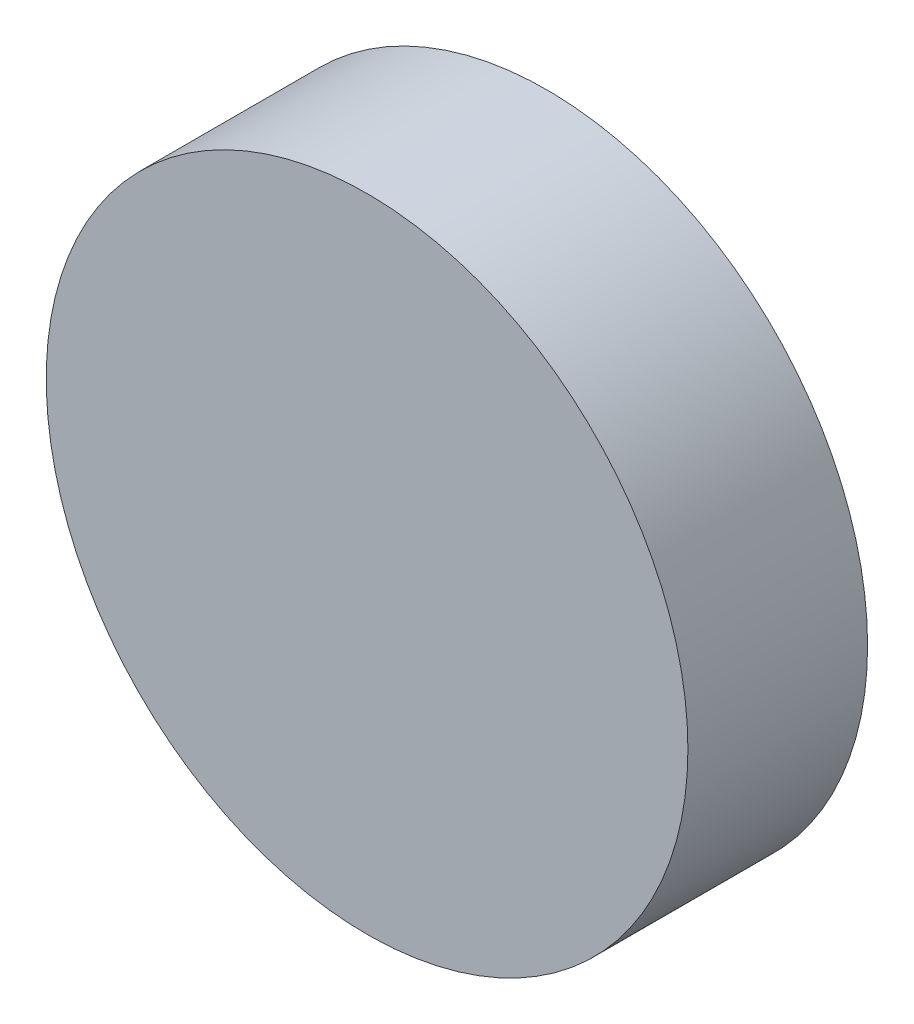
ISO-10303-21;
HEADER;
FILE_DESCRIPTION(('STEP AP214'),'2;1');
FILE_NAME('part.step','',(''),(''),'','','');
FILE_SCHEMA(('AUTOMOTIVE_DESIGN { 1 0 10303 214 1 1 1 1 }'));
ENDSEC;
DATA;
#1=APPLICATION_CONTEXT('core data for automotive mechanical design processes');
#2=APPLICATION_PROTOCOL_DEFINITION('international standard','automotive_design',2000,#1);
#3=PRODUCT_CONTEXT('',#1,'mechanical');
#4=PRODUCT('Part','Part','',(#3));
#5=PRODUCT_RELATED_PRODUCT_CATEGORY('part','',(#4));
#6=PRODUCT_DEFINITION_FORMATION('','',#4);
#7=PRODUCT_DEFINITION_CONTEXT('part definition',#1,'design');
#8=PRODUCT_DEFINITION('design','',#6,#7);
#9=PRODUCT_DEFINITION_SHAPE('','',#8);
#10=(LENGTH_UNIT() NAMED_UNIT(*) SI_UNIT(.MILLI.,.METRE.));
#11=(NAMED_UNIT(*) PLANE_ANGLE_UNIT() SI_UNIT($,.RADIAN.));
#12=(NAMED_UNIT(*) SI_UNIT($,.STERADIAN.) SOLID_ANGLE_UNIT());
#13=UNCERTAINTY_MEASURE_WITH_UNIT(LENGTH_MEASURE(1.E-05),#10,'distance_accuracy_value','');
#14=(GEOMETRIC_REPRESENTATION_CONTEXT(3) GLOBAL_UNCERTAINTY_ASSIGNED_CONTEXT((#13)) GLOBAL_UNIT_ASSIGNED_CONTEXT((#10,
#11,#12)) REPRESENTATION_CONTEXT('',''));
#15=CARTESIAN_POINT('',(0.,0.,0.));
#16=DIRECTION('',(0.,0.,1.));
#17=DIRECTION('',(1.,0.,0.));
#18=AXIS2_PLACEMENT_3D('',#15,#16,#17);
#19=CARTESIAN_POINT('',(0.,0.,70.));
#20=DIRECTION('',(0.,0.,-1.));
#21=DIRECTION('',(-1.,0.,0.));
#22=AXIS2_PLACEMENT_3D('',#19,#20,#21);
#23=CYLINDRICAL_SURFACE('',#22,125.);
#24=CARTESIAN_POINT('',(0.,0.,70.));
#25=DIRECTION('',(0.,0.,1.));
#26=DIRECTION('',(1.,0.,0.));
#27=AXIS2_PLACEMENT_3D('',#24,#25,#26);
#28=CIRCLE('',#27,125.);
#29=CARTESIAN_POINT('',(125.,0.,70.));
#30=VERTEX_POINT('',#29);
#31=EDGE_CURVE('E10',#30,#30,#28,.T.);
#32=ORIENTED_EDGE('',*,*,#31,.F.);
#33=EDGE_LOOP('',(#32));
#34=FACE_BOUND('',#33,.T.);
#35=CARTESIAN_POINT('',(0.,0.,0.));
#36=DIRECTION('',(0.,0.,1.));
#37=DIRECTION('',(1.,0.,0.));
#38=AXIS2_PLACEMENT_3D('',#35,#36,#37);
#39=CIRCLE('',#38,125.);
#40=CARTESIAN_POINT('',(125.,0.,0.));
#41=VERTEX_POINT('',#40);
#42=EDGE_CURVE('E32',#41,#41,#39,.T.);
#43=ORIENTED_EDGE('',*,*,#42,.T.);
#44=EDGE_LOOP('',(#43));
#45=FACE_BOUND('',#44,.T.);
#46=ADVANCED_FACE('F29',(#34,#45),#23,.T.);
#47=CARTESIAN_POINT('',(0.,0.,70.));
#48=DIRECTION('',(0.,0.,1.));
#49=DIRECTION('',(1.,0.,0.));
#50=AXIS2_PLACEMENT_3D('',#47,#48,#49);
#51=PLANE('',#50);
#52=ORIENTED_EDGE('',*,*,#31,.T.);
#53=EDGE_LOOP('',(#52));
#54=FACE_BOUND('',#53,.T.);
#55=ADVANCED_FACE('F44',(#54),#51,.T.);
#56=CARTESIAN_POINT('',(0.,0.,0.));
#57=DIRECTION('',(0.,0.,1.));
#58=DIRECTION('',(1.,0.,0.));
#59=AXIS2_PLACEMENT_3D('',#56,#57,#58);
#60=PLANE('',#59);
#61=ORIENTED_EDGE('',*,*,#42,.F.);
#62=EDGE_LOOP('',(#61));
#63=FACE_BOUND('',#62,.T.);
#64=ADVANCED_FACE('F42',(#63),#60,.F.);
#65=CLOSED_SHELL('',(#46,#55,#64));
#66=MANIFOLD_SOLID_BREP('B2',#65);
#67=ADVANCED_BREP_SHAPE_REPRESENTATION('',(#18,#66),#14);
#68=SHAPE_DEFINITION_REPRESENTATION(#9,#67);
ENDSEC;
END-ISO-10303-21;
